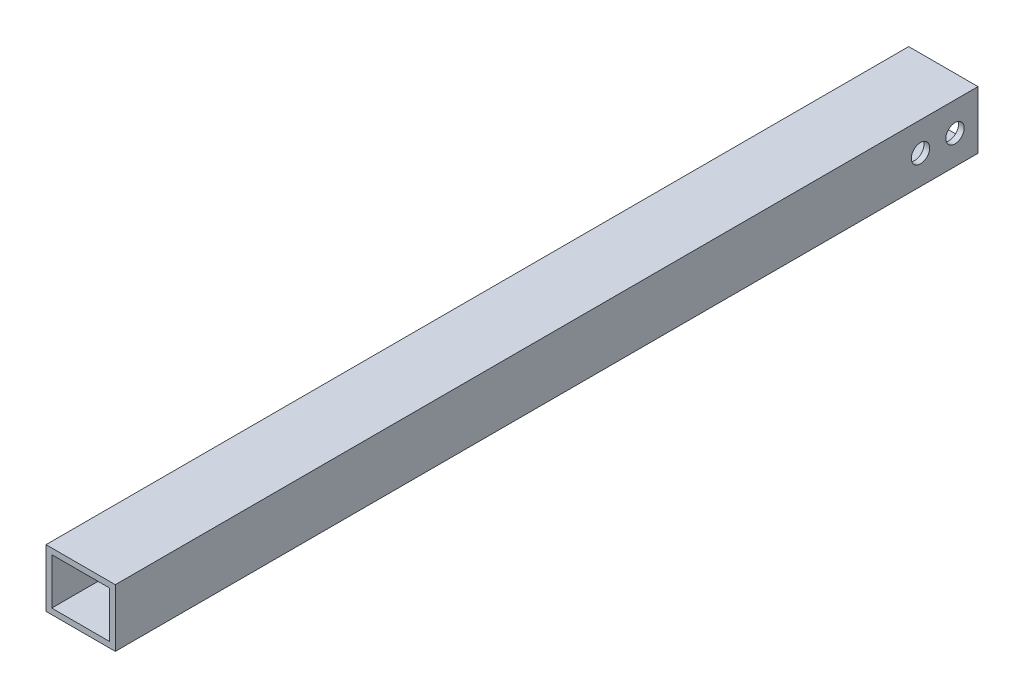
ISO-10303-21;
HEADER;
FILE_DESCRIPTION(('STEP AP214'),'2;1');
FILE_NAME('part.step','',(''),(''),'','','');
FILE_SCHEMA(('AUTOMOTIVE_DESIGN { 1 0 10303 214 1 1 1 1 }'));
ENDSEC;
DATA;
#1=APPLICATION_CONTEXT('core data for automotive mechanical design processes');
#2=APPLICATION_PROTOCOL_DEFINITION('international standard','automotive_design',2000,#1);
#3=PRODUCT_CONTEXT('',#1,'mechanical');
#4=PRODUCT('Part','Part','',(#3));
#5=PRODUCT_RELATED_PRODUCT_CATEGORY('part','',(#4));
#6=PRODUCT_DEFINITION_FORMATION('','',#4);
#7=PRODUCT_DEFINITION_CONTEXT('part definition',#1,'design');
#8=PRODUCT_DEFINITION('design','',#6,#7);
#9=PRODUCT_DEFINITION_SHAPE('','',#8);
#10=(LENGTH_UNIT() NAMED_UNIT(*) SI_UNIT(.MILLI.,.METRE.));
#11=(NAMED_UNIT(*) PLANE_ANGLE_UNIT() SI_UNIT($,.RADIAN.));
#12=(NAMED_UNIT(*) SI_UNIT($,.STERADIAN.) SOLID_ANGLE_UNIT());
#13=UNCERTAINTY_MEASURE_WITH_UNIT(LENGTH_MEASURE(1.E-05),#10,'distance_accuracy_value','');
#14=(GEOMETRIC_REPRESENTATION_CONTEXT(3) GLOBAL_UNCERTAINTY_ASSIGNED_CONTEXT((#13)) GLOBAL_UNIT_ASSIGNED_CONTEXT((#10,
#11,#12)) REPRESENTATION_CONTEXT('',''));
#15=CARTESIAN_POINT('',(0.,0.,0.));
#16=DIRECTION('',(0.,0.,1.));
#17=DIRECTION('',(1.,0.,0.));
#18=AXIS2_PLACEMENT_3D('',#15,#16,#17);
#19=CARTESIAN_POINT('',(0.,0.,150.));
#20=DIRECTION('',(0.,0.,1.));
#21=DIRECTION('',(1.,0.,0.));
#22=AXIS2_PLACEMENT_3D('',#19,#20,#21);
#23=PLANE('',#22);
#24=DIRECTION('',(0.,-1.,0.));
#25=VECTOR('',#24,1.);
#26=CARTESIAN_POINT('',(0.,0.,150.));
#27=LINE('',#26,#25);
#28=CARTESIAN_POINT('',(0.,10.05,150.));
#29=VERTEX_POINT('',#28);
#30=CARTESIAN_POINT('',(0.,0.,150.));
#31=VERTEX_POINT('',#30);
#32=EDGE_CURVE('E160',#29,#31,#27,.T.);
#33=ORIENTED_EDGE('',*,*,#32,.T.);
#34=DIRECTION('',(1.,0.,0.));
#35=VECTOR('',#34,1.);
#36=CARTESIAN_POINT('',(0.,0.,150.));
#37=LINE('',#36,#35);
#38=CARTESIAN_POINT('',(12.05,0.,150.));
#39=VERTEX_POINT('',#38);
#40=EDGE_CURVE('E163',#31,#39,#37,.T.);
#41=ORIENTED_EDGE('',*,*,#40,.T.);
#42=DIRECTION('',(0.,1.,0.));
#43=VECTOR('',#42,1.);
#44=CARTESIAN_POINT('',(12.05,0.,150.));
#45=LINE('',#44,#43);
#46=CARTESIAN_POINT('',(12.05,10.05,150.));
#47=VERTEX_POINT('',#46);
#48=EDGE_CURVE('E166',#39,#47,#45,.T.);
#49=ORIENTED_EDGE('',*,*,#48,.T.);
#50=DIRECTION('',(-1.,0.,0.));
#51=VECTOR('',#50,1.);
#52=CARTESIAN_POINT('',(0.,10.05,150.));
#53=LINE('',#52,#51);
#54=EDGE_CURVE('E168',#47,#29,#53,.T.);
#55=ORIENTED_EDGE('',*,*,#54,.T.);
#56=EDGE_LOOP('',(#33,#41,#49,#55));
#57=FACE_BOUND('',#56,.T.);
#58=DIRECTION('',(1.,0.,0.));
#59=VECTOR('',#58,1.);
#60=CARTESIAN_POINT('',(0.,1.,150.));
#61=LINE('',#60,#59);
#62=CARTESIAN_POINT('',(1.,1.,150.));
#63=VERTEX_POINT('',#62);
#64=CARTESIAN_POINT('',(11.05,1.,150.));
#65=VERTEX_POINT('',#64);
#66=EDGE_CURVE('E130',#63,#65,#61,.T.);
#67=ORIENTED_EDGE('',*,*,#66,.F.);
#68=DIRECTION('',(0.,-1.,0.));
#69=VECTOR('',#68,1.);
#70=CARTESIAN_POINT('',(1.,0.,150.));
#71=LINE('',#70,#69);
#72=CARTESIAN_POINT('',(1.,9.05,150.));
#73=VERTEX_POINT('',#72);
#74=EDGE_CURVE('E122',#73,#63,#71,.T.);
#75=ORIENTED_EDGE('',*,*,#74,.F.);
#76=DIRECTION('',(-1.,0.,0.));
#77=VECTOR('',#76,1.);
#78=CARTESIAN_POINT('',(0.,9.05,150.));
#79=LINE('',#78,#77);
#80=CARTESIAN_POINT('',(11.05,9.05,150.));
#81=VERTEX_POINT('',#80);
#82=EDGE_CURVE('E144',#81,#73,#79,.T.);
#83=ORIENTED_EDGE('',*,*,#82,.F.);
#84=DIRECTION('',(0.,1.,0.));
#85=VECTOR('',#84,1.);
#86=CARTESIAN_POINT('',(11.05,0.,150.));
#87=LINE('',#86,#85);
#88=EDGE_CURVE('E142',#65,#81,#87,.T.);
#89=ORIENTED_EDGE('',*,*,#88,.F.);
#90=EDGE_LOOP('',(#67,#75,#83,#89));
#91=FACE_BOUND('',#90,.T.);
#92=ADVANCED_FACE('F57',(#57,#91),#23,.T.);
#93=CARTESIAN_POINT('',(0.,0.,0.));
#94=DIRECTION('',(0.,0.,1.));
#95=DIRECTION('',(1.,0.,0.));
#96=AXIS2_PLACEMENT_3D('',#93,#94,#95);
#97=PLANE('',#96);
#98=DIRECTION('',(0.,-1.,0.));
#99=VECTOR('',#98,1.);
#100=CARTESIAN_POINT('',(0.,0.,0.));
#101=LINE('',#100,#99);
#102=CARTESIAN_POINT('',(0.,10.05,0.));
#103=VERTEX_POINT('',#102);
#104=CARTESIAN_POINT('',(0.,0.,0.));
#105=VERTEX_POINT('',#104);
#106=EDGE_CURVE('E138',#103,#105,#101,.T.);
#107=ORIENTED_EDGE('',*,*,#106,.F.);
#108=DIRECTION('',(-1.,0.,0.));
#109=VECTOR('',#108,1.);
#110=CARTESIAN_POINT('',(0.,10.05,0.));
#111=LINE('',#110,#109);
#112=CARTESIAN_POINT('',(12.05,10.05,0.));
#113=VERTEX_POINT('',#112);
#114=EDGE_CURVE('E164',#113,#103,#111,.T.);
#115=ORIENTED_EDGE('',*,*,#114,.F.);
#116=DIRECTION('',(0.,1.,0.));
#117=VECTOR('',#116,1.);
#118=CARTESIAN_POINT('',(12.05,0.,0.));
#119=LINE('',#118,#117);
#120=CARTESIAN_POINT('',(12.05,0.,0.));
#121=VERTEX_POINT('',#120);
#122=EDGE_CURVE('E175',#121,#113,#119,.T.);
#123=ORIENTED_EDGE('',*,*,#122,.F.);
#124=DIRECTION('',(1.,0.,0.));
#125=VECTOR('',#124,1.);
#126=CARTESIAN_POINT('',(0.,0.,0.));
#127=LINE('',#126,#125);
#128=EDGE_CURVE('E173',#105,#121,#127,.T.);
#129=ORIENTED_EDGE('',*,*,#128,.F.);
#130=EDGE_LOOP('',(#107,#115,#123,#129));
#131=FACE_BOUND('',#130,.T.);
#132=DIRECTION('',(0.,-1.,0.));
#133=VECTOR('',#132,1.);
#134=CARTESIAN_POINT('',(1.,0.,0.));
#135=LINE('',#134,#133);
#136=CARTESIAN_POINT('',(1.,9.05,0.));
#137=VERTEX_POINT('',#136);
#138=CARTESIAN_POINT('',(1.,1.,0.));
#139=VERTEX_POINT('',#138);
#140=EDGE_CURVE('E80',#137,#139,#135,.T.);
#141=ORIENTED_EDGE('',*,*,#140,.T.);
#142=DIRECTION('',(1.,0.,0.));
#143=VECTOR('',#142,1.);
#144=CARTESIAN_POINT('',(0.,1.,0.));
#145=LINE('',#144,#143);
#146=CARTESIAN_POINT('',(11.05,1.,0.));
#147=VERTEX_POINT('',#146);
#148=EDGE_CURVE('E137',#139,#147,#145,.T.);
#149=ORIENTED_EDGE('',*,*,#148,.T.);
#150=DIRECTION('',(0.,1.,0.));
#151=VECTOR('',#150,1.);
#152=CARTESIAN_POINT('',(11.05,0.,0.));
#153=LINE('',#152,#151);
#154=CARTESIAN_POINT('',(11.05,9.05,0.));
#155=VERTEX_POINT('',#154);
#156=EDGE_CURVE('E152',#147,#155,#153,.T.);
#157=ORIENTED_EDGE('',*,*,#156,.T.);
#158=DIRECTION('',(-1.,0.,0.));
#159=VECTOR('',#158,1.);
#160=CARTESIAN_POINT('',(0.,9.05,0.));
#161=LINE('',#160,#159);
#162=EDGE_CURVE('E131',#155,#137,#161,.T.);
#163=ORIENTED_EDGE('',*,*,#162,.T.);
#164=EDGE_LOOP('',(#141,#149,#157,#163));
#165=FACE_BOUND('',#164,.T.);
#166=ADVANCED_FACE('F193',(#131,#165),#97,.F.);
#167=CARTESIAN_POINT('',(0.,0.,150.));
#168=DIRECTION('',(1.,0.,0.));
#169=DIRECTION('',(0.,0.,-1.));
#170=AXIS2_PLACEMENT_3D('',#167,#168,#169);
#171=PLANE('',#170);
#172=ORIENTED_EDGE('',*,*,#106,.T.);
#173=DIRECTION('',(0.,0.,-1.));
#174=VECTOR('',#173,1.);
#175=CARTESIAN_POINT('',(0.,0.,150.));
#176=LINE('',#175,#174);
#177=EDGE_CURVE('E12',#31,#105,#176,.T.);
#178=ORIENTED_EDGE('',*,*,#177,.F.);
#179=ORIENTED_EDGE('',*,*,#32,.F.);
#180=DIRECTION('',(0.,0.,-1.));
#181=VECTOR('',#180,1.);
#182=CARTESIAN_POINT('',(0.,10.05,150.));
#183=LINE('',#182,#181);
#184=EDGE_CURVE('E170',#29,#103,#183,.T.);
#185=ORIENTED_EDGE('',*,*,#184,.T.);
#186=EDGE_LOOP('',(#172,#178,#179,#185));
#187=FACE_BOUND('',#186,.T.);
#188=ADVANCED_FACE('F59',(#187),#171,.F.);
#189=CARTESIAN_POINT('',(0.,0.,150.));
#190=DIRECTION('',(0.,1.,0.));
#191=DIRECTION('',(0.,0.,1.));
#192=AXIS2_PLACEMENT_3D('',#189,#190,#191);
#193=PLANE('',#192);
#194=CARTESIAN_POINT('',(6.025,0.,80.));
#195=DIRECTION('',(0.,-1.,0.));
#196=DIRECTION('',(0.,0.,-1.));
#197=AXIS2_PLACEMENT_3D('',#194,#195,#196);
#198=CIRCLE('',#197,1.6);
#199=CARTESIAN_POINT('',(6.025,0.,78.4));
#200=VERTEX_POINT('',#199);
#201=EDGE_CURVE('E150',#200,#200,#198,.T.);
#202=ORIENTED_EDGE('',*,*,#201,.F.);
#203=EDGE_LOOP('',(#202));
#204=FACE_BOUND('',#203,.T.);
#205=ORIENTED_EDGE('',*,*,#128,.T.);
#206=DIRECTION('',(0.,0.,-1.));
#207=VECTOR('',#206,1.);
#208=CARTESIAN_POINT('',(12.05,0.,150.));
#209=LINE('',#208,#207);
#210=EDGE_CURVE('E65',#39,#121,#209,.T.);
#211=ORIENTED_EDGE('',*,*,#210,.F.);
#212=ORIENTED_EDGE('',*,*,#40,.F.);
#213=ORIENTED_EDGE('',*,*,#177,.T.);
#214=EDGE_LOOP('',(#205,#211,#212,#213));
#215=FACE_BOUND('',#214,.T.);
#216=ADVANCED_FACE('F203',(#204,#215),#193,.F.);
#217=CARTESIAN_POINT('',(12.05,0.,150.));
#218=DIRECTION('',(-1.,0.,0.));
#219=DIRECTION('',(0.,0.,1.));
#220=AXIS2_PLACEMENT_3D('',#217,#218,#219);
#221=PLANE('',#220);
#222=CARTESIAN_POINT('',(12.05,5.025,10.));
#223=DIRECTION('',(1.,0.,0.));
#224=DIRECTION('',(0.,0.,-1.));
#225=AXIS2_PLACEMENT_3D('',#222,#223,#224);
#226=CIRCLE('',#225,1.6);
#227=CARTESIAN_POINT('',(12.05,5.025,8.4));
#228=VERTEX_POINT('',#227);
#229=EDGE_CURVE('E260',#228,#228,#226,.T.);
#230=ORIENTED_EDGE('',*,*,#229,.F.);
#231=EDGE_LOOP('',(#230));
#232=FACE_BOUND('',#231,.T.);
#233=CARTESIAN_POINT('',(12.05,5.025,4.));
#234=DIRECTION('',(1.,0.,0.));
#235=DIRECTION('',(0.,0.,-1.));
#236=AXIS2_PLACEMENT_3D('',#233,#234,#235);
#237=CIRCLE('',#236,1.6);
#238=CARTESIAN_POINT('',(12.05,5.025,2.4));
#239=VERTEX_POINT('',#238);
#240=EDGE_CURVE('E264',#239,#239,#237,.T.);
#241=ORIENTED_EDGE('',*,*,#240,.F.);
#242=EDGE_LOOP('',(#241));
#243=FACE_BOUND('',#242,.T.);
#244=ORIENTED_EDGE('',*,*,#122,.T.);
#245=DIRECTION('',(0.,0.,-1.));
#246=VECTOR('',#245,1.);
#247=CARTESIAN_POINT('',(12.05,10.05,150.));
#248=LINE('',#247,#246);
#249=EDGE_CURVE('E180',#47,#113,#248,.T.);
#250=ORIENTED_EDGE('',*,*,#249,.F.);
#251=ORIENTED_EDGE('',*,*,#48,.F.);
#252=ORIENTED_EDGE('',*,*,#210,.T.);
#253=EDGE_LOOP('',(#244,#250,#251,#252));
#254=FACE_BOUND('',#253,.T.);
#255=ADVANCED_FACE('F187',(#232,#243,#254),#221,.F.);
#256=CARTESIAN_POINT('',(0.,10.05,150.));
#257=DIRECTION('',(0.,-1.,0.));
#258=DIRECTION('',(0.,0.,-1.));
#259=AXIS2_PLACEMENT_3D('',#256,#257,#258);
#260=PLANE('',#259);
#261=ORIENTED_EDGE('',*,*,#114,.T.);
#262=ORIENTED_EDGE('',*,*,#184,.F.);
#263=ORIENTED_EDGE('',*,*,#54,.F.);
#264=ORIENTED_EDGE('',*,*,#249,.T.);
#265=EDGE_LOOP('',(#261,#262,#263,#264));
#266=FACE_BOUND('',#265,.T.);
#267=ADVANCED_FACE('F197',(#266),#260,.F.);
#268=CARTESIAN_POINT('',(1.,0.,150.));
#269=DIRECTION('',(1.,0.,0.));
#270=DIRECTION('',(0.,0.,-1.));
#271=AXIS2_PLACEMENT_3D('',#268,#269,#270);
#272=PLANE('',#271);
#273=ORIENTED_EDGE('',*,*,#140,.F.);
#274=DIRECTION('',(0.,0.,-1.));
#275=VECTOR('',#274,1.);
#276=CARTESIAN_POINT('',(1.,9.05,150.));
#277=LINE('',#276,#275);
#278=EDGE_CURVE('E126',#73,#137,#277,.T.);
#279=ORIENTED_EDGE('',*,*,#278,.F.);
#280=ORIENTED_EDGE('',*,*,#74,.T.);
#281=DIRECTION('',(0.,0.,-1.));
#282=VECTOR('',#281,1.);
#283=CARTESIAN_POINT('',(1.,1.,150.));
#284=LINE('',#283,#282);
#285=EDGE_CURVE('E125',#63,#139,#284,.T.);
#286=ORIENTED_EDGE('',*,*,#285,.T.);
#287=EDGE_LOOP('',(#273,#279,#280,#286));
#288=FACE_BOUND('',#287,.T.);
#289=ADVANCED_FACE('F124',(#288),#272,.T.);
#290=CARTESIAN_POINT('',(0.,1.,150.));
#291=DIRECTION('',(0.,1.,0.));
#292=DIRECTION('',(0.,0.,1.));
#293=AXIS2_PLACEMENT_3D('',#290,#291,#292);
#294=PLANE('',#293);
#295=CARTESIAN_POINT('',(6.025,0.999999999999999,80.));
#296=DIRECTION('',(0.,1.,0.));
#297=DIRECTION('',(0.,0.,1.));
#298=AXIS2_PLACEMENT_3D('',#295,#296,#297);
#299=CIRCLE('',#298,1.6);
#300=CARTESIAN_POINT('',(6.025,0.999999999999999,81.6));
#301=VERTEX_POINT('',#300);
#302=EDGE_CURVE('E269',#301,#301,#299,.F.);
#303=ORIENTED_EDGE('',*,*,#302,.T.);
#304=EDGE_LOOP('',(#303));
#305=FACE_BOUND('',#304,.T.);
#306=ORIENTED_EDGE('',*,*,#148,.F.);
#307=ORIENTED_EDGE('',*,*,#285,.F.);
#308=ORIENTED_EDGE('',*,*,#66,.T.);
#309=DIRECTION('',(0.,0.,-1.));
#310=VECTOR('',#309,1.);
#311=CARTESIAN_POINT('',(11.05,1.,150.));
#312=LINE('',#311,#310);
#313=EDGE_CURVE('E139',#65,#147,#312,.T.);
#314=ORIENTED_EDGE('',*,*,#313,.T.);
#315=EDGE_LOOP('',(#306,#307,#308,#314));
#316=FACE_BOUND('',#315,.T.);
#317=ADVANCED_FACE('F134',(#305,#316),#294,.T.);
#318=CARTESIAN_POINT('',(11.05,0.,150.));
#319=DIRECTION('',(-1.,0.,0.));
#320=DIRECTION('',(0.,0.,1.));
#321=AXIS2_PLACEMENT_3D('',#318,#319,#320);
#322=PLANE('',#321);
#323=CARTESIAN_POINT('',(11.05,5.025,10.));
#324=DIRECTION('',(-1.,0.,0.));
#325=DIRECTION('',(0.,0.,1.));
#326=AXIS2_PLACEMENT_3D('',#323,#324,#325);
#327=CIRCLE('',#326,1.6);
#328=CARTESIAN_POINT('',(11.05,5.025,8.4));
#329=VERTEX_POINT('',#328);
#330=EDGE_CURVE('E257',#329,#329,#327,.F.);
#331=ORIENTED_EDGE('',*,*,#330,.T.);
#332=EDGE_LOOP('',(#331));
#333=FACE_BOUND('',#332,.T.);
#334=CARTESIAN_POINT('',(11.05,5.025,4.));
#335=DIRECTION('',(-1.,0.,0.));
#336=DIRECTION('',(0.,0.,1.));
#337=AXIS2_PLACEMENT_3D('',#334,#335,#336);
#338=CIRCLE('',#337,1.6);
#339=CARTESIAN_POINT('',(11.05,5.025,2.4));
#340=VERTEX_POINT('',#339);
#341=EDGE_CURVE('E261',#340,#340,#338,.F.);
#342=ORIENTED_EDGE('',*,*,#341,.T.);
#343=EDGE_LOOP('',(#342));
#344=FACE_BOUND('',#343,.T.);
#345=ORIENTED_EDGE('',*,*,#156,.F.);
#346=ORIENTED_EDGE('',*,*,#313,.F.);
#347=ORIENTED_EDGE('',*,*,#88,.T.);
#348=DIRECTION('',(0.,0.,-1.));
#349=VECTOR('',#348,1.);
#350=CARTESIAN_POINT('',(11.05,9.05,150.));
#351=LINE('',#350,#349);
#352=EDGE_CURVE('E72',#81,#155,#351,.T.);
#353=ORIENTED_EDGE('',*,*,#352,.T.);
#354=EDGE_LOOP('',(#345,#346,#347,#353));
#355=FACE_BOUND('',#354,.T.);
#356=ADVANCED_FACE('F229',(#333,#344,#355),#322,.T.);
#357=CARTESIAN_POINT('',(0.,9.05,150.));
#358=DIRECTION('',(0.,-1.,0.));
#359=DIRECTION('',(0.,0.,-1.));
#360=AXIS2_PLACEMENT_3D('',#357,#358,#359);
#361=PLANE('',#360);
#362=ORIENTED_EDGE('',*,*,#162,.F.);
#363=ORIENTED_EDGE('',*,*,#352,.F.);
#364=ORIENTED_EDGE('',*,*,#82,.T.);
#365=ORIENTED_EDGE('',*,*,#278,.T.);
#366=EDGE_LOOP('',(#362,#363,#364,#365));
#367=FACE_BOUND('',#366,.T.);
#368=ADVANCED_FACE('F234',(#367),#361,.T.);
#369=CARTESIAN_POINT('',(6.025,10.051,80.));
#370=DIRECTION('',(0.,-1.,0.));
#371=DIRECTION('',(0.,0.,-1.));
#372=AXIS2_PLACEMENT_3D('',#369,#370,#371);
#373=CYLINDRICAL_SURFACE('',#372,1.6);
#374=ORIENTED_EDGE('',*,*,#302,.F.);
#375=EDGE_LOOP('',(#374));
#376=FACE_BOUND('',#375,.T.);
#377=ORIENTED_EDGE('',*,*,#201,.T.);
#378=EDGE_LOOP('',(#377));
#379=FACE_BOUND('',#378,.T.);
#380=ADVANCED_FACE('F241',(#376,#379),#373,.F.);
#381=CARTESIAN_POINT('',(-0.000999999999999265,5.025,4.));
#382=DIRECTION('',(1.,0.,0.));
#383=DIRECTION('',(0.,0.,-1.));
#384=AXIS2_PLACEMENT_3D('',#381,#382,#383);
#385=CYLINDRICAL_SURFACE('',#384,1.6);
#386=CARTESIAN_POINT('',(11.05,5.025,2.4));
#387=CARTESIAN_POINT('',(11.0604166666667,5.025,2.4));
#388=CARTESIAN_POINT('',(11.0708333333333,5.025,2.4));
#389=CARTESIAN_POINT('',(11.0916666666667,5.025,2.4));
#390=CARTESIAN_POINT('',(11.1020833333333,5.025,2.4));
#391=CARTESIAN_POINT('',(11.1229166666667,5.025,2.4));
#392=CARTESIAN_POINT('',(11.1333333333333,5.025,2.4));
#393=CARTESIAN_POINT('',(11.1541666666667,5.025,2.4));
#394=CARTESIAN_POINT('',(11.1645833333333,5.025,2.4));
#395=CARTESIAN_POINT('',(11.1854166666667,5.025,2.4));
#396=CARTESIAN_POINT('',(11.1958333333333,5.025,2.4));
#397=CARTESIAN_POINT('',(11.2166666666667,5.025,2.4));
#398=CARTESIAN_POINT('',(11.2270833333333,5.025,2.4));
#399=CARTESIAN_POINT('',(11.2479166666667,5.025,2.4));
#400=CARTESIAN_POINT('',(11.2583333333333,5.025,2.4));
#401=CARTESIAN_POINT('',(11.2791666666667,5.025,2.4));
#402=CARTESIAN_POINT('',(11.2895833333333,5.025,2.4));
#403=CARTESIAN_POINT('',(11.3104166666667,5.025,2.4));
#404=CARTESIAN_POINT('',(11.3208333333333,5.025,2.4));
#405=CARTESIAN_POINT('',(11.3416666666667,5.025,2.4));
#406=CARTESIAN_POINT('',(11.3520833333333,5.025,2.4));
#407=CARTESIAN_POINT('',(11.3729166666667,5.025,2.4));
#408=CARTESIAN_POINT('',(11.3833333333333,5.025,2.4));
#409=CARTESIAN_POINT('',(11.4041666666667,5.025,2.4));
#410=CARTESIAN_POINT('',(11.4145833333333,5.025,2.4));
#411=CARTESIAN_POINT('',(11.4354166666667,5.025,2.4));
#412=CARTESIAN_POINT('',(11.4458333333333,5.025,2.4));
#413=CARTESIAN_POINT('',(11.4666666666667,5.025,2.4));
#414=CARTESIAN_POINT('',(11.4770833333333,5.025,2.4));
#415=CARTESIAN_POINT('',(11.4979166666667,5.025,2.4));
#416=CARTESIAN_POINT('',(11.5083333333333,5.025,2.4));
#417=CARTESIAN_POINT('',(11.5291666666667,5.025,2.4));
#418=CARTESIAN_POINT('',(11.5395833333333,5.025,2.4));
#419=CARTESIAN_POINT('',(11.5604166666667,5.025,2.4));
#420=CARTESIAN_POINT('',(11.5708333333333,5.025,2.4));
#421=CARTESIAN_POINT('',(11.5916666666667,5.025,2.4));
#422=CARTESIAN_POINT('',(11.6020833333333,5.025,2.4));
#423=CARTESIAN_POINT('',(11.6229166666667,5.025,2.4));
#424=CARTESIAN_POINT('',(11.6333333333333,5.025,2.4));
#425=CARTESIAN_POINT('',(11.6541666666667,5.025,2.4));
#426=CARTESIAN_POINT('',(11.6645833333333,5.025,2.4));
#427=CARTESIAN_POINT('',(11.6854166666667,5.025,2.4));
#428=CARTESIAN_POINT('',(11.6958333333333,5.025,2.4));
#429=CARTESIAN_POINT('',(11.7166666666667,5.025,2.4));
#430=CARTESIAN_POINT('',(11.7270833333333,5.025,2.4));
#431=CARTESIAN_POINT('',(11.7479166666667,5.025,2.4));
#432=CARTESIAN_POINT('',(11.7583333333333,5.025,2.4));
#433=CARTESIAN_POINT('',(11.7791666666667,5.025,2.4));
#434=CARTESIAN_POINT('',(11.7895833333333,5.025,2.4));
#435=CARTESIAN_POINT('',(11.8104166666667,5.025,2.4));
#436=CARTESIAN_POINT('',(11.8208333333333,5.025,2.4));
#437=CARTESIAN_POINT('',(11.8416666666667,5.025,2.4));
#438=CARTESIAN_POINT('',(11.8520833333333,5.025,2.4));
#439=CARTESIAN_POINT('',(11.8729166666667,5.025,2.4));
#440=CARTESIAN_POINT('',(11.8833333333333,5.025,2.4));
#441=CARTESIAN_POINT('',(11.9041666666667,5.025,2.4));
#442=CARTESIAN_POINT('',(11.9145833333333,5.025,2.4));
#443=CARTESIAN_POINT('',(11.9354166666667,5.025,2.4));
#444=CARTESIAN_POINT('',(11.9458333333333,5.025,2.4));
#445=CARTESIAN_POINT('',(11.9666666666667,5.025,2.4));
#446=CARTESIAN_POINT('',(11.9770833333333,5.025,2.4));
#447=CARTESIAN_POINT('',(11.9979166666667,5.025,2.4));
#448=CARTESIAN_POINT('',(12.0083333333333,5.025,2.4));
#449=CARTESIAN_POINT('',(12.0291666666667,5.025,2.4));
#450=CARTESIAN_POINT('',(12.0395833333333,5.025,2.4));
#451=CARTESIAN_POINT('',(12.05,5.025,2.4));
#452=B_SPLINE_CURVE_WITH_KNOTS('',3,(#386,#387,#388,#389,#390,#391,#392,#393,#394,#395,#396,
#397,#398,#399,#400,#401,#402,#403,#404,#405,#406,#407,#408,#409,#410,#411,#412,#413,#414,#415,
#416,#417,#418,#419,#420,#421,#422,#423,#424,#425,#426,#427,#428,#429,#430,#431,#432,#433,#434,
#435,#436,#437,#438,#439,#440,#441,#442,#443,#444,#445,#446,#447,#448,#449,#450,#451),
.UNSPECIFIED.,.F.,.F.,(4,2,2,2,2,2,2,2,2,2,2,2,2,2,2,2,2,2,2,2,2,2,2,2,2,2,2,2,2,2,2,2,4),(0.,
0.03125,0.0625000000000001,0.0937500000000001,0.125,0.15625,0.1875,0.21875,0.25,
0.281249999999999,0.312499999999999,0.343749999999999,0.374999999999999,0.406249999999999,
0.437499999999999,0.468749999999999,0.499999999999999,0.531249999999999,0.562499999999999,
0.593749999999999,0.624999999999999,0.656249999999999,0.687499999999999,0.718749999999999,
0.749999999999997,0.781249999999997,0.812499999999997,0.843749999999997,0.874999999999997,
0.906249999999997,0.937499999999997,0.968749999999997,0.999999999999997),.UNSPECIFIED.);
#453=EDGE_CURVE('BSEAM244',#340,#239,#452,.T.);
#454=ORIENTED_EDGE('',*,*,#341,.F.);
#455=ORIENTED_EDGE('',*,*,#240,.T.);
#456=ORIENTED_EDGE('',*,*,#453,.T.);
#457=ORIENTED_EDGE('',*,*,#453,.F.);
#458=EDGE_LOOP('',(#454,#456,#455,#457));
#459=FACE_BOUND('',#458,.T.);
#460=ADVANCED_FACE('F244',(#459),#385,.F.);
#461=CARTESIAN_POINT('',(-0.000999999999999265,5.025,10.));
#462=DIRECTION('',(1.,0.,0.));
#463=DIRECTION('',(0.,0.,-1.));
#464=AXIS2_PLACEMENT_3D('',#461,#462,#463);
#465=CYLINDRICAL_SURFACE('',#464,1.6);
#466=CARTESIAN_POINT('',(11.05,5.025,8.4));
#467=CARTESIAN_POINT('',(11.0604166666667,5.025,8.4));
#468=CARTESIAN_POINT('',(11.0708333333333,5.025,8.4));
#469=CARTESIAN_POINT('',(11.0916666666667,5.025,8.4));
#470=CARTESIAN_POINT('',(11.1020833333333,5.025,8.4));
#471=CARTESIAN_POINT('',(11.1229166666667,5.025,8.4));
#472=CARTESIAN_POINT('',(11.1333333333333,5.025,8.4));
#473=CARTESIAN_POINT('',(11.1541666666667,5.025,8.4));
#474=CARTESIAN_POINT('',(11.1645833333333,5.025,8.4));
#475=CARTESIAN_POINT('',(11.1854166666667,5.025,8.4));
#476=CARTESIAN_POINT('',(11.1958333333333,5.025,8.4));
#477=CARTESIAN_POINT('',(11.2166666666667,5.025,8.4));
#478=CARTESIAN_POINT('',(11.2270833333333,5.025,8.4));
#479=CARTESIAN_POINT('',(11.2479166666667,5.025,8.4));
#480=CARTESIAN_POINT('',(11.2583333333333,5.025,8.4));
#481=CARTESIAN_POINT('',(11.2791666666667,5.025,8.4));
#482=CARTESIAN_POINT('',(11.2895833333333,5.025,8.4));
#483=CARTESIAN_POINT('',(11.3104166666667,5.025,8.4));
#484=CARTESIAN_POINT('',(11.3208333333333,5.025,8.4));
#485=CARTESIAN_POINT('',(11.3416666666667,5.025,8.4));
#486=CARTESIAN_POINT('',(11.3520833333333,5.025,8.4));
#487=CARTESIAN_POINT('',(11.3729166666667,5.025,8.4));
#488=CARTESIAN_POINT('',(11.3833333333333,5.025,8.4));
#489=CARTESIAN_POINT('',(11.4041666666667,5.025,8.4));
#490=CARTESIAN_POINT('',(11.4145833333333,5.025,8.4));
#491=CARTESIAN_POINT('',(11.4354166666667,5.025,8.4));
#492=CARTESIAN_POINT('',(11.4458333333333,5.025,8.4));
#493=CARTESIAN_POINT('',(11.4666666666667,5.025,8.4));
#494=CARTESIAN_POINT('',(11.4770833333333,5.025,8.4));
#495=CARTESIAN_POINT('',(11.4979166666667,5.025,8.4));
#496=CARTESIAN_POINT('',(11.5083333333333,5.025,8.4));
#497=CARTESIAN_POINT('',(11.5291666666667,5.025,8.4));
#498=CARTESIAN_POINT('',(11.5395833333333,5.025,8.4));
#499=CARTESIAN_POINT('',(11.5604166666667,5.025,8.4));
#500=CARTESIAN_POINT('',(11.5708333333333,5.025,8.4));
#501=CARTESIAN_POINT('',(11.5916666666667,5.025,8.4));
#502=CARTESIAN_POINT('',(11.6020833333333,5.025,8.4));
#503=CARTESIAN_POINT('',(11.6229166666667,5.025,8.4));
#504=CARTESIAN_POINT('',(11.6333333333333,5.025,8.4));
#505=CARTESIAN_POINT('',(11.6541666666667,5.025,8.4));
#506=CARTESIAN_POINT('',(11.6645833333333,5.025,8.4));
#507=CARTESIAN_POINT('',(11.6854166666667,5.025,8.4));
#508=CARTESIAN_POINT('',(11.6958333333333,5.025,8.4));
#509=CARTESIAN_POINT('',(11.7166666666667,5.025,8.4));
#510=CARTESIAN_POINT('',(11.7270833333333,5.025,8.4));
#511=CARTESIAN_POINT('',(11.7479166666667,5.025,8.4));
#512=CARTESIAN_POINT('',(11.7583333333333,5.025,8.4));
#513=CARTESIAN_POINT('',(11.7791666666667,5.025,8.4));
#514=CARTESIAN_POINT('',(11.7895833333333,5.025,8.4));
#515=CARTESIAN_POINT('',(11.8104166666667,5.025,8.4));
#516=CARTESIAN_POINT('',(11.8208333333333,5.025,8.4));
#517=CARTESIAN_POINT('',(11.8416666666667,5.025,8.4));
#518=CARTESIAN_POINT('',(11.8520833333333,5.025,8.4));
#519=CARTESIAN_POINT('',(11.8729166666667,5.025,8.4));
#520=CARTESIAN_POINT('',(11.8833333333333,5.025,8.4));
#521=CARTESIAN_POINT('',(11.9041666666667,5.025,8.4));
#522=CARTESIAN_POINT('',(11.9145833333333,5.025,8.4));
#523=CARTESIAN_POINT('',(11.9354166666667,5.025,8.4));
#524=CARTESIAN_POINT('',(11.9458333333333,5.025,8.4));
#525=CARTESIAN_POINT('',(11.9666666666667,5.025,8.4));
#526=CARTESIAN_POINT('',(11.9770833333333,5.025,8.4));
#527=CARTESIAN_POINT('',(11.9979166666667,5.025,8.4));
#528=CARTESIAN_POINT('',(12.0083333333333,5.025,8.4));
#529=CARTESIAN_POINT('',(12.0291666666667,5.025,8.4));
#530=CARTESIAN_POINT('',(12.0395833333333,5.025,8.4));
#531=CARTESIAN_POINT('',(12.05,5.025,8.4));
#532=B_SPLINE_CURVE_WITH_KNOTS('',3,(#466,#467,#468,#469,#470,#471,#472,#473,#474,#475,#476,
#477,#478,#479,#480,#481,#482,#483,#484,#485,#486,#487,#488,#489,#490,#491,#492,#493,#494,#495,
#496,#497,#498,#499,#500,#501,#502,#503,#504,#505,#506,#507,#508,#509,#510,#511,#512,#513,#514,
#515,#516,#517,#518,#519,#520,#521,#522,#523,#524,#525,#526,#527,#528,#529,#530,#531),
.UNSPECIFIED.,.F.,.F.,(4,2,2,2,2,2,2,2,2,2,2,2,2,2,2,2,2,2,2,2,2,2,2,2,2,2,2,2,2,2,2,2,4),(0.,
0.03125,0.0625000000000001,0.0937500000000001,0.125,0.15625,0.1875,0.21875,0.25,
0.281249999999999,0.312499999999999,0.343749999999999,0.374999999999999,0.406249999999999,
0.437499999999999,0.468749999999999,0.499999999999999,0.531249999999999,0.562499999999999,
0.593749999999999,0.624999999999999,0.656249999999999,0.687499999999999,0.718749999999999,
0.749999999999997,0.781249999999997,0.812499999999997,0.843749999999997,0.874999999999997,
0.906249999999997,0.937499999999997,0.968749999999997,0.999999999999997),.UNSPECIFIED.);
#533=EDGE_CURVE('BSEAM248',#329,#228,#532,.T.);
#534=ORIENTED_EDGE('',*,*,#330,.F.);
#535=ORIENTED_EDGE('',*,*,#229,.T.);
#536=ORIENTED_EDGE('',*,*,#533,.T.);
#537=ORIENTED_EDGE('',*,*,#533,.F.);
#538=EDGE_LOOP('',(#534,#536,#535,#537));
#539=FACE_BOUND('',#538,.T.);
#540=ADVANCED_FACE('F248',(#539),#465,.F.);
#541=CLOSED_SHELL('',(#92,#166,#188,#216,#255,#267,#289,#317,#356,#368,#380,#460,#540));
#542=MANIFOLD_SOLID_BREP('B2',#541);
#543=ADVANCED_BREP_SHAPE_REPRESENTATION('',(#18,#542),#14);
#544=SHAPE_DEFINITION_REPRESENTATION(#9,#543);
ENDSEC;
END-ISO-10303-21;
